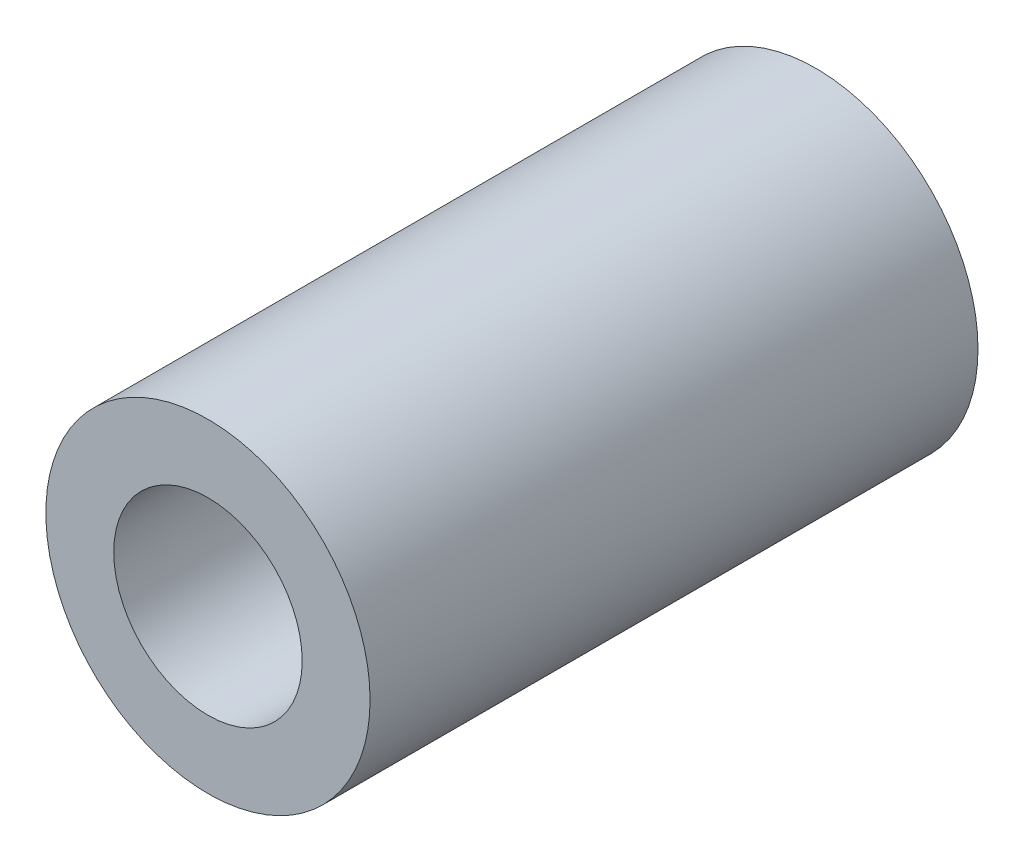
ISO-10303-21;
HEADER;
FILE_DESCRIPTION(('STEP AP214'),'2;1');
FILE_NAME('part.step','',(''),(''),'','','');
FILE_SCHEMA(('AUTOMOTIVE_DESIGN { 1 0 10303 214 1 1 1 1 }'));
ENDSEC;
DATA;
#1=APPLICATION_CONTEXT('core data for automotive mechanical design processes');
#2=APPLICATION_PROTOCOL_DEFINITION('international standard','automotive_design',2000,#1);
#3=PRODUCT_CONTEXT('',#1,'mechanical');
#4=PRODUCT('Part','Part','',(#3));
#5=PRODUCT_RELATED_PRODUCT_CATEGORY('part','',(#4));
#6=PRODUCT_DEFINITION_FORMATION('','',#4);
#7=PRODUCT_DEFINITION_CONTEXT('part definition',#1,'design');
#8=PRODUCT_DEFINITION('design','',#6,#7);
#9=PRODUCT_DEFINITION_SHAPE('','',#8);
#10=(LENGTH_UNIT() NAMED_UNIT(*) SI_UNIT(.MILLI.,.METRE.));
#11=(NAMED_UNIT(*) PLANE_ANGLE_UNIT() SI_UNIT($,.RADIAN.));
#12=(NAMED_UNIT(*) SI_UNIT($,.STERADIAN.) SOLID_ANGLE_UNIT());
#13=UNCERTAINTY_MEASURE_WITH_UNIT(LENGTH_MEASURE(1.E-05),#10,'distance_accuracy_value','');
#14=(GEOMETRIC_REPRESENTATION_CONTEXT(3) GLOBAL_UNCERTAINTY_ASSIGNED_CONTEXT((#13)) GLOBAL_UNIT_ASSIGNED_CONTEXT((#10,
#11,#12)) REPRESENTATION_CONTEXT('',''));
#15=CARTESIAN_POINT('',(0.,0.,0.));
#16=DIRECTION('',(0.,0.,1.));
#17=DIRECTION('',(1.,0.,0.));
#18=AXIS2_PLACEMENT_3D('',#15,#16,#17);
#19=CARTESIAN_POINT('',(0.,0.,30.));
#20=DIRECTION('',(0.,0.,1.));
#21=DIRECTION('',(1.,0.,0.));
#22=AXIS2_PLACEMENT_3D('',#19,#20,#21);
#23=PLANE('',#22);
#24=CARTESIAN_POINT('',(0.,0.,30.));
#25=DIRECTION('',(0.,0.,-1.));
#26=DIRECTION('',(-1.,0.,0.));
#27=AXIS2_PLACEMENT_3D('',#24,#25,#26);
#28=CIRCLE('',#27,4.65);
#29=CARTESIAN_POINT('',(-4.65,0.,30.));
#30=VERTEX_POINT('',#29);
#31=EDGE_CURVE('E26',#30,#30,#28,.T.);
#32=ORIENTED_EDGE('',*,*,#31,.T.);
#33=EDGE_LOOP('',(#32));
#34=FACE_BOUND('',#33,.T.);
#35=CARTESIAN_POINT('',(0.,0.,30.));
#36=DIRECTION('',(0.,0.,1.));
#37=DIRECTION('',(1.,0.,0.));
#38=AXIS2_PLACEMENT_3D('',#35,#36,#37);
#39=CIRCLE('',#38,8.);
#40=CARTESIAN_POINT('',(8.,0.,30.));
#41=VERTEX_POINT('',#40);
#42=EDGE_CURVE('E10',#41,#41,#39,.T.);
#43=ORIENTED_EDGE('',*,*,#42,.T.);
#44=EDGE_LOOP('',(#43));
#45=FACE_BOUND('',#44,.T.);
#46=ADVANCED_FACE('F15',(#34,#45),#23,.T.);
#47=CARTESIAN_POINT('',(0.,0.,0.));
#48=DIRECTION('',(0.,0.,1.));
#49=DIRECTION('',(1.,0.,0.));
#50=AXIS2_PLACEMENT_3D('',#47,#48,#49);
#51=PLANE('',#50);
#52=CARTESIAN_POINT('',(0.,0.,0.));
#53=DIRECTION('',(0.,0.,-1.));
#54=DIRECTION('',(-1.,0.,0.));
#55=AXIS2_PLACEMENT_3D('',#52,#53,#54);
#56=CIRCLE('',#55,4.65);
#57=CARTESIAN_POINT('',(-4.65,0.,0.));
#58=VERTEX_POINT('',#57);
#59=EDGE_CURVE('E28',#58,#58,#56,.T.);
#60=ORIENTED_EDGE('',*,*,#59,.F.);
#61=EDGE_LOOP('',(#60));
#62=FACE_BOUND('',#61,.T.);
#63=CARTESIAN_POINT('',(0.,0.,0.));
#64=DIRECTION('',(0.,0.,1.));
#65=DIRECTION('',(1.,0.,0.));
#66=AXIS2_PLACEMENT_3D('',#63,#64,#65);
#67=CIRCLE('',#66,8.);
#68=CARTESIAN_POINT('',(8.,0.,0.));
#69=VERTEX_POINT('',#68);
#70=EDGE_CURVE('E19',#69,#69,#67,.T.);
#71=ORIENTED_EDGE('',*,*,#70,.F.);
#72=EDGE_LOOP('',(#71));
#73=FACE_BOUND('',#72,.T.);
#74=ADVANCED_FACE('F41',(#62,#73),#51,.F.);
#75=CARTESIAN_POINT('',(0.,0.,30.));
#76=DIRECTION('',(0.,0.,-1.));
#77=DIRECTION('',(-1.,0.,0.));
#78=AXIS2_PLACEMENT_3D('',#75,#76,#77);
#79=CYLINDRICAL_SURFACE('',#78,8.);
#80=ORIENTED_EDGE('',*,*,#42,.F.);
#81=EDGE_LOOP('',(#80));
#82=FACE_BOUND('',#81,.T.);
#83=ORIENTED_EDGE('',*,*,#70,.T.);
#84=EDGE_LOOP('',(#83));
#85=FACE_BOUND('',#84,.T.);
#86=ADVANCED_FACE('F17',(#82,#85),#79,.T.);
#87=CARTESIAN_POINT('',(0.,0.,30.));
#88=DIRECTION('',(0.,0.,-1.));
#89=DIRECTION('',(-1.,0.,0.));
#90=AXIS2_PLACEMENT_3D('',#87,#88,#89);
#91=CYLINDRICAL_SURFACE('',#90,4.65);
#92=ORIENTED_EDGE('',*,*,#31,.F.);
#93=EDGE_LOOP('',(#92));
#94=FACE_BOUND('',#93,.T.);
#95=ORIENTED_EDGE('',*,*,#59,.T.);
#96=EDGE_LOOP('',(#95));
#97=FACE_BOUND('',#96,.T.);
#98=ADVANCED_FACE('F35',(#94,#97),#91,.F.);
#99=CLOSED_SHELL('',(#46,#74,#86,#98));
#100=MANIFOLD_SOLID_BREP('B1',#99);
#101=ADVANCED_BREP_SHAPE_REPRESENTATION('',(#18,#100),#14);
#102=SHAPE_DEFINITION_REPRESENTATION(#9,#101);
ENDSEC;
END-ISO-10303-21;
